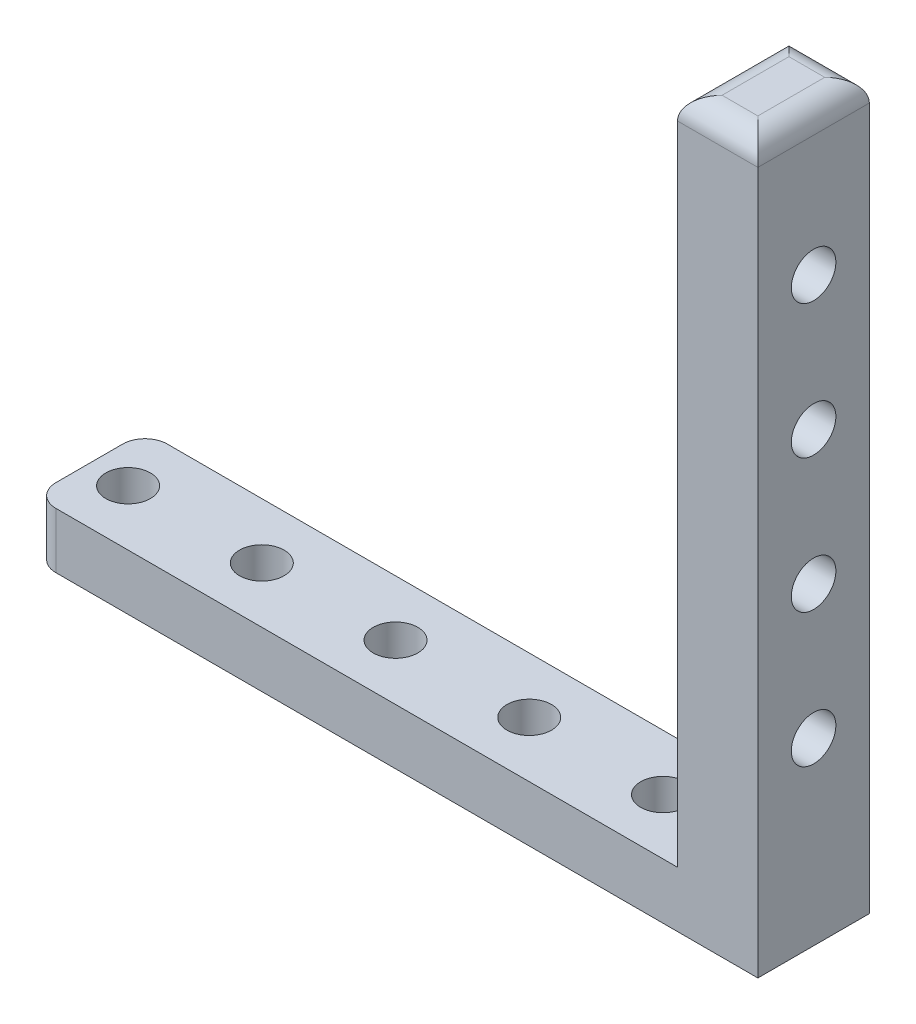
ISO-10303-21;
HEADER;
FILE_DESCRIPTION(('STEP AP214'),'2;1');
FILE_NAME('part.step','',(''),(''),'','','');
FILE_SCHEMA(('AUTOMOTIVE_DESIGN { 1 0 10303 214 1 1 1 1 }'));
ENDSEC;
DATA;
#1=APPLICATION_CONTEXT('core data for automotive mechanical design processes');
#2=APPLICATION_PROTOCOL_DEFINITION('international standard','automotive_design',2000,#1);
#3=PRODUCT_CONTEXT('',#1,'mechanical');
#4=PRODUCT('Part','Part','',(#3));
#5=PRODUCT_RELATED_PRODUCT_CATEGORY('part','',(#4));
#6=PRODUCT_DEFINITION_FORMATION('','',#4);
#7=PRODUCT_DEFINITION_CONTEXT('part definition',#1,'design');
#8=PRODUCT_DEFINITION('design','',#6,#7);
#9=PRODUCT_DEFINITION_SHAPE('','',#8);
#10=(LENGTH_UNIT() NAMED_UNIT(*) SI_UNIT(.MILLI.,.METRE.));
#11=(NAMED_UNIT(*) PLANE_ANGLE_UNIT() SI_UNIT($,.RADIAN.));
#12=(NAMED_UNIT(*) SI_UNIT($,.STERADIAN.) SOLID_ANGLE_UNIT());
#13=UNCERTAINTY_MEASURE_WITH_UNIT(LENGTH_MEASURE(1.E-05),#10,'distance_accuracy_value','');
#14=(GEOMETRIC_REPRESENTATION_CONTEXT(3) GLOBAL_UNCERTAINTY_ASSIGNED_CONTEXT((#13)) GLOBAL_UNIT_ASSIGNED_CONTEXT((#10,
#11,#12)) REPRESENTATION_CONTEXT('',''));
#15=CARTESIAN_POINT('',(0.,0.,0.));
#16=DIRECTION('',(0.,0.,1.));
#17=DIRECTION('',(1.,0.,0.));
#18=AXIS2_PLACEMENT_3D('',#15,#16,#17);
#19=CARTESIAN_POINT('',(-34.3748545633026,-10.,-0.80357142857143));
#20=DIRECTION('',(0.,1.,0.));
#21=DIRECTION('',(0.,0.,1.));
#22=AXIS2_PLACEMENT_3D('',#19,#20,#21);
#23=CYLINDRICAL_SURFACE('',#22,2.);
#24=CARTESIAN_POINT('',(-34.3748545633026,5.,-0.80357142857143));
#25=DIRECTION('',(0.,1.,0.));
#26=DIRECTION('',(0.,0.,1.));
#27=AXIS2_PLACEMENT_3D('',#24,#25,#26);
#28=CIRCLE('',#27,2.);
#29=CARTESIAN_POINT('',(-34.3748545633026,5.,1.19642857142857));
#30=VERTEX_POINT('',#29);
#31=EDGE_CURVE('E238',#30,#30,#28,.T.);
#32=ORIENTED_EDGE('',*,*,#31,.T.);
#33=EDGE_LOOP('',(#32));
#34=FACE_BOUND('',#33,.T.);
#35=CARTESIAN_POINT('',(-34.3748545633026,0.,-0.80357142857143));
#36=DIRECTION('',(0.,1.,0.));
#37=DIRECTION('',(0.,0.,1.));
#38=AXIS2_PLACEMENT_3D('',#35,#36,#37);
#39=CIRCLE('',#38,2.);
#40=CARTESIAN_POINT('',(-34.3748545633026,0.,1.19642857142857));
#41=VERTEX_POINT('',#40);
#42=EDGE_CURVE('E242',#41,#41,#39,.T.);
#43=ORIENTED_EDGE('',*,*,#42,.F.);
#44=EDGE_LOOP('',(#43));
#45=FACE_BOUND('',#44,.T.);
#46=ADVANCED_FACE('F43',(#34,#45),#23,.F.);
#47=CARTESIAN_POINT('',(-22.3748545633026,-10.,-0.80357142857143));
#48=DIRECTION('',(0.,1.,0.));
#49=DIRECTION('',(0.,0.,1.));
#50=AXIS2_PLACEMENT_3D('',#47,#48,#49);
#51=CYLINDRICAL_SURFACE('',#50,2.);
#52=CARTESIAN_POINT('',(-22.3748545633026,5.,-0.80357142857143));
#53=DIRECTION('',(0.,1.,0.));
#54=DIRECTION('',(0.,0.,1.));
#55=AXIS2_PLACEMENT_3D('',#52,#53,#54);
#56=CIRCLE('',#55,2.);
#57=CARTESIAN_POINT('',(-22.3748545633026,5.,1.19642857142857));
#58=VERTEX_POINT('',#57);
#59=EDGE_CURVE('E230',#58,#58,#56,.T.);
#60=ORIENTED_EDGE('',*,*,#59,.T.);
#61=EDGE_LOOP('',(#60));
#62=FACE_BOUND('',#61,.T.);
#63=CARTESIAN_POINT('',(-22.3748545633026,0.,-0.80357142857143));
#64=DIRECTION('',(0.,1.,0.));
#65=DIRECTION('',(0.,0.,1.));
#66=AXIS2_PLACEMENT_3D('',#63,#64,#65);
#67=CIRCLE('',#66,2.);
#68=CARTESIAN_POINT('',(-22.3748545633026,0.,1.19642857142857));
#69=VERTEX_POINT('',#68);
#70=EDGE_CURVE('E234',#69,#69,#67,.T.);
#71=ORIENTED_EDGE('',*,*,#70,.F.);
#72=EDGE_LOOP('',(#71));
#73=FACE_BOUND('',#72,.T.);
#74=ADVANCED_FACE('F330',(#62,#73),#51,.F.);
#75=CARTESIAN_POINT('',(-10.3748545633026,-10.,-0.80357142857143));
#76=DIRECTION('',(0.,1.,0.));
#77=DIRECTION('',(0.,0.,1.));
#78=AXIS2_PLACEMENT_3D('',#75,#76,#77);
#79=CYLINDRICAL_SURFACE('',#78,2.);
#80=CARTESIAN_POINT('',(-10.3748545633026,5.,-0.80357142857143));
#81=DIRECTION('',(0.,1.,0.));
#82=DIRECTION('',(0.,0.,1.));
#83=AXIS2_PLACEMENT_3D('',#80,#81,#82);
#84=CIRCLE('',#83,2.);
#85=CARTESIAN_POINT('',(-10.3748545633026,5.,1.19642857142857));
#86=VERTEX_POINT('',#85);
#87=EDGE_CURVE('E219',#86,#86,#84,.T.);
#88=ORIENTED_EDGE('',*,*,#87,.T.);
#89=EDGE_LOOP('',(#88));
#90=FACE_BOUND('',#89,.T.);
#91=CARTESIAN_POINT('',(-10.3748545633026,0.,-0.80357142857143));
#92=DIRECTION('',(0.,1.,0.));
#93=DIRECTION('',(0.,0.,1.));
#94=AXIS2_PLACEMENT_3D('',#91,#92,#93);
#95=CIRCLE('',#94,2.);
#96=CARTESIAN_POINT('',(-10.3748545633026,0.,1.19642857142857));
#97=VERTEX_POINT('',#96);
#98=EDGE_CURVE('E226',#97,#97,#95,.T.);
#99=ORIENTED_EDGE('',*,*,#98,.F.);
#100=EDGE_LOOP('',(#99));
#101=FACE_BOUND('',#100,.T.);
#102=ADVANCED_FACE('F336',(#90,#101),#79,.F.);
#103=CARTESIAN_POINT('',(-37.8571428571429,5.,-5.80357142857143));
#104=DIRECTION('',(1.,0.,0.));
#105=DIRECTION('',(0.,0.,-1.));
#106=AXIS2_PLACEMENT_3D('',#103,#104,#105);
#107=PLANE('',#106);
#108=DIRECTION('',(0.,0.,1.));
#109=VECTOR('',#108,1.);
#110=CARTESIAN_POINT('',(-37.8571428571429,5.,-5.80357142857143));
#111=LINE('',#110,#109);
#112=CARTESIAN_POINT('',(-37.8571428571429,5.,-3.80357142857143));
#113=VERTEX_POINT('',#112);
#114=CARTESIAN_POINT('',(-37.8571428571429,5.,2.19642857142857));
#115=VERTEX_POINT('',#114);
#116=EDGE_CURVE('E140',#113,#115,#111,.T.);
#117=ORIENTED_EDGE('',*,*,#116,.F.);
#118=DIRECTION('',(0.,-1.,0.));
#119=VECTOR('',#118,1.);
#120=CARTESIAN_POINT('',(-37.8571428571429,5.,-3.80357142857143));
#121=LINE('',#120,#119);
#122=CARTESIAN_POINT('',(-37.8571428571429,0.,-3.80357142857143));
#123=VERTEX_POINT('',#122);
#124=EDGE_CURVE('E205',#113,#123,#121,.T.);
#125=ORIENTED_EDGE('',*,*,#124,.T.);
#126=DIRECTION('',(0.,0.,1.));
#127=VECTOR('',#126,1.);
#128=CARTESIAN_POINT('',(-37.8571428571429,0.,-5.80357142857143));
#129=LINE('',#128,#127);
#130=CARTESIAN_POINT('',(-37.8571428571429,0.,2.19642857142857));
#131=VERTEX_POINT('',#130);
#132=EDGE_CURVE('E173',#123,#131,#129,.T.);
#133=ORIENTED_EDGE('',*,*,#132,.T.);
#134=DIRECTION('',(0.,-1.,0.));
#135=VECTOR('',#134,1.);
#136=CARTESIAN_POINT('',(-37.8571428571429,5.,2.19642857142857));
#137=LINE('',#136,#135);
#138=EDGE_CURVE('E199',#131,#115,#137,.F.);
#139=ORIENTED_EDGE('',*,*,#138,.T.);
#140=EDGE_LOOP('',(#117,#125,#133,#139));
#141=FACE_BOUND('',#140,.T.);
#142=ADVANCED_FACE('F385',(#141),#107,.F.);
#143=CARTESIAN_POINT('',(-37.8571428571429,5.,4.19642857142857));
#144=DIRECTION('',(0.,0.,-1.));
#145=DIRECTION('',(-1.,0.,0.));
#146=AXIS2_PLACEMENT_3D('',#143,#144,#145);
#147=PLANE('',#146);
#148=DIRECTION('',(0.,-1.,0.));
#149=VECTOR('',#148,1.);
#150=CARTESIAN_POINT('',(27.1428571428571,5.,4.19642857142857));
#151=LINE('',#150,#149);
#152=CARTESIAN_POINT('',(27.1428571428571,63.,4.19642857142857));
#153=VERTEX_POINT('',#152);
#154=CARTESIAN_POINT('',(27.1428571428571,0.,4.19642857142857));
#155=VERTEX_POINT('',#154);
#156=EDGE_CURVE('E189',#153,#155,#151,.T.);
#157=ORIENTED_EDGE('',*,*,#156,.F.);
#158=DIRECTION('',(1.,0.,0.));
#159=VECTOR('',#158,1.);
#160=CARTESIAN_POINT('',(-37.8571428571429,63.,4.19642857142857));
#161=LINE('',#160,#159);
#162=CARTESIAN_POINT('',(19.9292264198915,63.,4.19642857142857));
#163=VERTEX_POINT('',#162);
#164=EDGE_CURVE('E11',#153,#163,#161,.F.);
#165=ORIENTED_EDGE('',*,*,#164,.T.);
#166=DIRECTION('',(0.,-1.,0.));
#167=VECTOR('',#166,1.);
#168=CARTESIAN_POINT('',(19.9292264198915,65.,4.19642857142857));
#169=LINE('',#168,#167);
#170=CARTESIAN_POINT('',(19.9292264198915,5.,4.19642857142857));
#171=VERTEX_POINT('',#170);
#172=EDGE_CURVE('E120',#163,#171,#169,.T.);
#173=ORIENTED_EDGE('',*,*,#172,.T.);
#174=DIRECTION('',(1.,0.,0.));
#175=VECTOR('',#174,1.);
#176=CARTESIAN_POINT('',(-37.8571428571429,5.,4.19642857142857));
#177=LINE('',#176,#175);
#178=CARTESIAN_POINT('',(-35.8571428571429,5.,4.19642857142857));
#179=VERTEX_POINT('',#178);
#180=EDGE_CURVE('E124',#179,#171,#177,.T.);
#181=ORIENTED_EDGE('',*,*,#180,.F.);
#182=DIRECTION('',(0.,-1.,0.));
#183=VECTOR('',#182,1.);
#184=CARTESIAN_POINT('',(-35.8571428571429,5.,4.19642857142857));
#185=LINE('',#184,#183);
#186=CARTESIAN_POINT('',(-35.8571428571429,0.,4.19642857142857));
#187=VERTEX_POINT('',#186);
#188=EDGE_CURVE('E192',#179,#187,#185,.T.);
#189=ORIENTED_EDGE('',*,*,#188,.T.);
#190=DIRECTION('',(1.,0.,0.));
#191=VECTOR('',#190,1.);
#192=CARTESIAN_POINT('',(-37.8571428571429,0.,4.19642857142857));
#193=LINE('',#192,#191);
#194=EDGE_CURVE('E176',#187,#155,#193,.T.);
#195=ORIENTED_EDGE('',*,*,#194,.T.);
#196=EDGE_LOOP('',(#157,#165,#173,#181,#189,#195));
#197=FACE_BOUND('',#196,.T.);
#198=ADVANCED_FACE('F122',(#197),#147,.F.);
#199=CARTESIAN_POINT('',(27.1428571428571,5.,-5.80357142857143));
#200=DIRECTION('',(-1.,0.,0.));
#201=DIRECTION('',(0.,0.,1.));
#202=AXIS2_PLACEMENT_3D('',#199,#200,#201);
#203=PLANE('',#202);
#204=CARTESIAN_POINT('',(27.1428571428571,52.14,-0.803571428571429));
#205=DIRECTION('',(-1.,0.,0.));
#206=DIRECTION('',(0.,0.,1.));
#207=AXIS2_PLACEMENT_3D('',#204,#205,#206);
#208=CIRCLE('',#207,2.);
#209=CARTESIAN_POINT('',(27.1428571428571,52.14,1.19642857142857));
#210=VERTEX_POINT('',#209);
#211=EDGE_CURVE('E296',#210,#210,#208,.T.);
#212=ORIENTED_EDGE('',*,*,#211,.T.);
#213=EDGE_LOOP('',(#212));
#214=FACE_BOUND('',#213,.T.);
#215=CARTESIAN_POINT('',(27.1428571428571,16.14,-0.803571428571429));
#216=DIRECTION('',(-1.,0.,0.));
#217=DIRECTION('',(0.,0.,1.));
#218=AXIS2_PLACEMENT_3D('',#215,#216,#217);
#219=CIRCLE('',#218,2.);
#220=CARTESIAN_POINT('',(27.1428571428571,16.14,1.19642857142857));
#221=VERTEX_POINT('',#220);
#222=EDGE_CURVE('E287',#221,#221,#219,.T.);
#223=ORIENTED_EDGE('',*,*,#222,.T.);
#224=EDGE_LOOP('',(#223));
#225=FACE_BOUND('',#224,.T.);
#226=CARTESIAN_POINT('',(27.1428571428571,40.14,-0.803571428571429));
#227=DIRECTION('',(-1.,0.,0.));
#228=DIRECTION('',(0.,0.,1.));
#229=AXIS2_PLACEMENT_3D('',#226,#227,#228);
#230=CIRCLE('',#229,2.);
#231=CARTESIAN_POINT('',(27.1428571428571,40.14,1.19642857142857));
#232=VERTEX_POINT('',#231);
#233=EDGE_CURVE('E303',#232,#232,#230,.T.);
#234=ORIENTED_EDGE('',*,*,#233,.T.);
#235=EDGE_LOOP('',(#234));
#236=FACE_BOUND('',#235,.T.);
#237=CARTESIAN_POINT('',(27.1428571428571,28.14,-0.803571428571429));
#238=DIRECTION('',(-1.,0.,0.));
#239=DIRECTION('',(0.,0.,1.));
#240=AXIS2_PLACEMENT_3D('',#237,#238,#239);
#241=CIRCLE('',#240,2.);
#242=CARTESIAN_POINT('',(27.1428571428571,28.14,1.19642857142857));
#243=VERTEX_POINT('',#242);
#244=EDGE_CURVE('E144',#243,#243,#241,.T.);
#245=ORIENTED_EDGE('',*,*,#244,.T.);
#246=EDGE_LOOP('',(#245));
#247=FACE_BOUND('',#246,.T.);
#248=DIRECTION('',(0.,-1.,0.));
#249=VECTOR('',#248,1.);
#250=CARTESIAN_POINT('',(27.1428571428571,5.,-5.80357142857143));
#251=LINE('',#250,#249);
#252=CARTESIAN_POINT('',(27.1428571428571,63.,-5.80357142857143));
#253=VERTEX_POINT('',#252);
#254=CARTESIAN_POINT('',(27.1428571428571,0.,-5.80357142857143));
#255=VERTEX_POINT('',#254);
#256=EDGE_CURVE('E172',#253,#255,#251,.T.);
#257=ORIENTED_EDGE('',*,*,#256,.F.);
#258=DIRECTION('',(0.,0.,-1.));
#259=VECTOR('',#258,1.);
#260=CARTESIAN_POINT('',(27.1428571428571,63.,-5.80357142857143));
#261=LINE('',#260,#259);
#262=EDGE_CURVE('E259',#253,#153,#261,.F.);
#263=ORIENTED_EDGE('',*,*,#262,.T.);
#264=ORIENTED_EDGE('',*,*,#156,.T.);
#265=DIRECTION('',(0.,0.,-1.));
#266=VECTOR('',#265,1.);
#267=CARTESIAN_POINT('',(27.1428571428571,0.,-5.80357142857143));
#268=LINE('',#267,#266);
#269=EDGE_CURVE('E180',#155,#255,#268,.T.);
#270=ORIENTED_EDGE('',*,*,#269,.T.);
#271=EDGE_LOOP('',(#257,#263,#264,#270));
#272=FACE_BOUND('',#271,.T.);
#273=ADVANCED_FACE('F368',(#214,#225,#236,#247,#272),#203,.F.);
#274=CARTESIAN_POINT('',(-37.8571428571429,5.,-5.80357142857143));
#275=DIRECTION('',(0.,0.,1.));
#276=DIRECTION('',(1.,0.,0.));
#277=AXIS2_PLACEMENT_3D('',#274,#275,#276);
#278=PLANE('',#277);
#279=DIRECTION('',(0.,-1.,0.));
#280=VECTOR('',#279,1.);
#281=CARTESIAN_POINT('',(19.9292264198915,65.,-5.80357142857143));
#282=LINE('',#281,#280);
#283=CARTESIAN_POINT('',(19.9292264198915,63.,-5.80357142857143));
#284=VERTEX_POINT('',#283);
#285=CARTESIAN_POINT('',(19.9292264198915,5.,-5.80357142857143));
#286=VERTEX_POINT('',#285);
#287=EDGE_CURVE('E128',#284,#286,#282,.T.);
#288=ORIENTED_EDGE('',*,*,#287,.F.);
#289=DIRECTION('',(-1.,0.,0.));
#290=VECTOR('',#289,1.);
#291=CARTESIAN_POINT('',(-37.8571428571429,63.,-5.80357142857143));
#292=LINE('',#291,#290);
#293=EDGE_CURVE('E53',#284,#253,#292,.F.);
#294=ORIENTED_EDGE('',*,*,#293,.T.);
#295=ORIENTED_EDGE('',*,*,#256,.T.);
#296=DIRECTION('',(-1.,0.,0.));
#297=VECTOR('',#296,1.);
#298=CARTESIAN_POINT('',(-37.8571428571429,0.,-5.80357142857143));
#299=LINE('',#298,#297);
#300=CARTESIAN_POINT('',(-35.8571428571429,0.,-5.80357142857143));
#301=VERTEX_POINT('',#300);
#302=EDGE_CURVE('E168',#255,#301,#299,.T.);
#303=ORIENTED_EDGE('',*,*,#302,.T.);
#304=DIRECTION('',(0.,-1.,0.));
#305=VECTOR('',#304,1.);
#306=CARTESIAN_POINT('',(-35.8571428571429,5.,-5.80357142857143));
#307=LINE('',#306,#305);
#308=CARTESIAN_POINT('',(-35.8571428571429,5.,-5.80357142857143));
#309=VERTEX_POINT('',#308);
#310=EDGE_CURVE('E212',#301,#309,#307,.F.);
#311=ORIENTED_EDGE('',*,*,#310,.T.);
#312=DIRECTION('',(-1.,0.,0.));
#313=VECTOR('',#312,1.);
#314=CARTESIAN_POINT('',(-37.8571428571429,5.,-5.80357142857143));
#315=LINE('',#314,#313);
#316=EDGE_CURVE('E139',#286,#309,#315,.T.);
#317=ORIENTED_EDGE('',*,*,#316,.F.);
#318=EDGE_LOOP('',(#288,#294,#295,#303,#311,#317));
#319=FACE_BOUND('',#318,.T.);
#320=ADVANCED_FACE('F365',(#319),#278,.F.);
#321=CARTESIAN_POINT('',(0.,5.,0.));
#322=DIRECTION('',(0.,1.,0.));
#323=DIRECTION('',(0.,0.,1.));
#324=AXIS2_PLACEMENT_3D('',#321,#322,#323);
#325=PLANE('',#324);
#326=DIRECTION('',(0.,0.,1.));
#327=VECTOR('',#326,1.);
#328=CARTESIAN_POINT('',(19.9292264198915,5.,-5.80357142857143));
#329=LINE('',#328,#327);
#330=EDGE_CURVE('E129',#286,#171,#329,.T.);
#331=ORIENTED_EDGE('',*,*,#330,.F.);
#332=ORIENTED_EDGE('',*,*,#316,.T.);
#333=CARTESIAN_POINT('',(-35.8571428571429,5.,-3.80357142857143));
#334=DIRECTION('',(0.,1.,0.));
#335=DIRECTION('',(0.,0.,1.));
#336=AXIS2_PLACEMENT_3D('',#333,#334,#335);
#337=CIRCLE('',#336,2.);
#338=EDGE_CURVE('E216',#309,#113,#337,.T.);
#339=ORIENTED_EDGE('',*,*,#338,.T.);
#340=ORIENTED_EDGE('',*,*,#116,.T.);
#341=CARTESIAN_POINT('',(-35.8571428571429,5.,2.19642857142857));
#342=DIRECTION('',(0.,1.,0.));
#343=DIRECTION('',(0.,0.,1.));
#344=AXIS2_PLACEMENT_3D('',#341,#342,#343);
#345=CIRCLE('',#344,2.);
#346=EDGE_CURVE('E137',#115,#179,#345,.T.);
#347=ORIENTED_EDGE('',*,*,#346,.T.);
#348=ORIENTED_EDGE('',*,*,#180,.T.);
#349=EDGE_LOOP('',(#331,#332,#339,#340,#347,#348));
#350=FACE_BOUND('',#349,.T.);
#351=CARTESIAN_POINT('',(1.62514543669738,5.,-0.80357142857143));
#352=DIRECTION('',(0.,1.,0.));
#353=DIRECTION('',(0.,0.,1.));
#354=AXIS2_PLACEMENT_3D('',#351,#352,#353);
#355=CIRCLE('',#354,2.);
#356=CARTESIAN_POINT('',(1.62514543669738,5.,1.19642857142857));
#357=VERTEX_POINT('',#356);
#358=EDGE_CURVE('E154',#357,#357,#355,.T.);
#359=ORIENTED_EDGE('',*,*,#358,.F.);
#360=EDGE_LOOP('',(#359));
#361=FACE_BOUND('',#360,.T.);
#362=CARTESIAN_POINT('',(13.6251454366974,5.,-0.80357142857143));
#363=DIRECTION('',(0.,1.,0.));
#364=DIRECTION('',(0.,0.,1.));
#365=AXIS2_PLACEMENT_3D('',#362,#363,#364);
#366=CIRCLE('',#365,2.);
#367=CARTESIAN_POINT('',(13.6251454366974,5.,1.19642857142857));
#368=VERTEX_POINT('',#367);
#369=EDGE_CURVE('E162',#368,#368,#366,.T.);
#370=ORIENTED_EDGE('',*,*,#369,.F.);
#371=EDGE_LOOP('',(#370));
#372=FACE_BOUND('',#371,.T.);
#373=ORIENTED_EDGE('',*,*,#87,.F.);
#374=EDGE_LOOP('',(#373));
#375=FACE_BOUND('',#374,.T.);
#376=ORIENTED_EDGE('',*,*,#59,.F.);
#377=EDGE_LOOP('',(#376));
#378=FACE_BOUND('',#377,.T.);
#379=ORIENTED_EDGE('',*,*,#31,.F.);
#380=EDGE_LOOP('',(#379));
#381=FACE_BOUND('',#380,.T.);
#382=ADVANCED_FACE('F133',(#350,#361,#372,#375,#378,#381),#325,.T.);
#383=CARTESIAN_POINT('',(0.,0.,0.));
#384=DIRECTION('',(0.,1.,0.));
#385=DIRECTION('',(0.,0.,1.));
#386=AXIS2_PLACEMENT_3D('',#383,#384,#385);
#387=PLANE('',#386);
#388=CARTESIAN_POINT('',(1.62514543669738,0.,-0.80357142857143));
#389=DIRECTION('',(0.,1.,0.));
#390=DIRECTION('',(0.,0.,1.));
#391=AXIS2_PLACEMENT_3D('',#388,#389,#390);
#392=CIRCLE('',#391,2.);
#393=CARTESIAN_POINT('',(1.62514543669738,0.,1.19642857142857));
#394=VERTEX_POINT('',#393);
#395=EDGE_CURVE('E158',#394,#394,#392,.T.);
#396=ORIENTED_EDGE('',*,*,#395,.T.);
#397=EDGE_LOOP('',(#396));
#398=FACE_BOUND('',#397,.T.);
#399=CARTESIAN_POINT('',(13.6251454366974,0.,-0.80357142857143));
#400=DIRECTION('',(0.,1.,0.));
#401=DIRECTION('',(0.,0.,1.));
#402=AXIS2_PLACEMENT_3D('',#399,#400,#401);
#403=CIRCLE('',#402,2.);
#404=CARTESIAN_POINT('',(13.6251454366974,0.,1.19642857142857));
#405=VERTEX_POINT('',#404);
#406=EDGE_CURVE('E166',#405,#405,#403,.T.);
#407=ORIENTED_EDGE('',*,*,#406,.T.);
#408=EDGE_LOOP('',(#407));
#409=FACE_BOUND('',#408,.T.);
#410=ORIENTED_EDGE('',*,*,#132,.F.);
#411=CARTESIAN_POINT('',(-35.8571428571429,0.,-3.80357142857143));
#412=DIRECTION('',(0.,1.,0.));
#413=DIRECTION('',(0.,0.,1.));
#414=AXIS2_PLACEMENT_3D('',#411,#412,#413);
#415=CIRCLE('',#414,2.);
#416=EDGE_CURVE('E209',#123,#301,#415,.F.);
#417=ORIENTED_EDGE('',*,*,#416,.T.);
#418=ORIENTED_EDGE('',*,*,#302,.F.);
#419=ORIENTED_EDGE('',*,*,#269,.F.);
#420=ORIENTED_EDGE('',*,*,#194,.F.);
#421=CARTESIAN_POINT('',(-35.8571428571429,0.,2.19642857142857));
#422=DIRECTION('',(0.,1.,0.));
#423=DIRECTION('',(0.,0.,1.));
#424=AXIS2_PLACEMENT_3D('',#421,#422,#423);
#425=CIRCLE('',#424,2.);
#426=EDGE_CURVE('E195',#187,#131,#425,.F.);
#427=ORIENTED_EDGE('',*,*,#426,.T.);
#428=EDGE_LOOP('',(#410,#417,#418,#419,#420,#427));
#429=FACE_BOUND('',#428,.T.);
#430=ORIENTED_EDGE('',*,*,#98,.T.);
#431=EDGE_LOOP('',(#430));
#432=FACE_BOUND('',#431,.T.);
#433=ORIENTED_EDGE('',*,*,#70,.T.);
#434=EDGE_LOOP('',(#433));
#435=FACE_BOUND('',#434,.T.);
#436=ORIENTED_EDGE('',*,*,#42,.T.);
#437=EDGE_LOOP('',(#436));
#438=FACE_BOUND('',#437,.T.);
#439=ADVANCED_FACE('F376',(#398,#409,#429,#432,#435,#438),#387,.F.);
#440=CARTESIAN_POINT('',(-35.8571428571429,5.,2.19642857142857));
#441=DIRECTION('',(0.,-1.,0.));
#442=DIRECTION('',(0.,0.,-1.));
#443=AXIS2_PLACEMENT_3D('',#440,#441,#442);
#444=CYLINDRICAL_SURFACE('',#443,2.);
#445=ORIENTED_EDGE('',*,*,#346,.F.);
#446=ORIENTED_EDGE('',*,*,#138,.F.);
#447=ORIENTED_EDGE('',*,*,#426,.F.);
#448=ORIENTED_EDGE('',*,*,#188,.F.);
#449=EDGE_LOOP('',(#445,#446,#447,#448));
#450=FACE_BOUND('',#449,.T.);
#451=ADVANCED_FACE('F388',(#450),#444,.T.);
#452=CARTESIAN_POINT('',(-35.8571428571429,5.,-3.80357142857143));
#453=DIRECTION('',(0.,-1.,0.));
#454=DIRECTION('',(0.,0.,-1.));
#455=AXIS2_PLACEMENT_3D('',#452,#453,#454);
#456=CYLINDRICAL_SURFACE('',#455,2.);
#457=ORIENTED_EDGE('',*,*,#338,.F.);
#458=ORIENTED_EDGE('',*,*,#310,.F.);
#459=ORIENTED_EDGE('',*,*,#416,.F.);
#460=ORIENTED_EDGE('',*,*,#124,.F.);
#461=EDGE_LOOP('',(#457,#458,#459,#460));
#462=FACE_BOUND('',#461,.T.);
#463=ADVANCED_FACE('F381',(#462),#456,.T.);
#464=CARTESIAN_POINT('',(13.6251454366974,-10.,-0.80357142857143));
#465=DIRECTION('',(0.,1.,0.));
#466=DIRECTION('',(0.,0.,1.));
#467=AXIS2_PLACEMENT_3D('',#464,#465,#466);
#468=CYLINDRICAL_SURFACE('',#467,2.);
#469=ORIENTED_EDGE('',*,*,#369,.T.);
#470=EDGE_LOOP('',(#469));
#471=FACE_BOUND('',#470,.T.);
#472=ORIENTED_EDGE('',*,*,#406,.F.);
#473=EDGE_LOOP('',(#472));
#474=FACE_BOUND('',#473,.T.);
#475=ADVANCED_FACE('F324',(#471,#474),#468,.F.);
#476=CARTESIAN_POINT('',(1.62514543669738,-10.,-0.80357142857143));
#477=DIRECTION('',(0.,1.,0.));
#478=DIRECTION('',(0.,0.,1.));
#479=AXIS2_PLACEMENT_3D('',#476,#477,#478);
#480=CYLINDRICAL_SURFACE('',#479,2.);
#481=ORIENTED_EDGE('',*,*,#358,.T.);
#482=EDGE_LOOP('',(#481));
#483=FACE_BOUND('',#482,.T.);
#484=ORIENTED_EDGE('',*,*,#395,.F.);
#485=EDGE_LOOP('',(#484));
#486=FACE_BOUND('',#485,.T.);
#487=ADVANCED_FACE('F315',(#483,#486),#480,.F.);
#488=CARTESIAN_POINT('',(19.9292264198915,65.,-5.80357142857143));
#489=DIRECTION('',(1.,0.,0.));
#490=DIRECTION('',(0.,0.,-1.));
#491=AXIS2_PLACEMENT_3D('',#488,#489,#490);
#492=PLANE('',#491);
#493=CARTESIAN_POINT('',(19.9292264198915,52.14,-0.803571428571429));
#494=DIRECTION('',(-1.,0.,0.));
#495=DIRECTION('',(0.,0.,1.));
#496=AXIS2_PLACEMENT_3D('',#493,#494,#495);
#497=CIRCLE('',#496,2.);
#498=CARTESIAN_POINT('',(19.9292264198915,52.14,1.19642857142857));
#499=VERTEX_POINT('',#498);
#500=EDGE_CURVE('E293',#499,#499,#497,.T.);
#501=ORIENTED_EDGE('',*,*,#500,.F.);
#502=EDGE_LOOP('',(#501));
#503=FACE_BOUND('',#502,.T.);
#504=CARTESIAN_POINT('',(19.9292264198915,16.14,-0.803571428571429));
#505=DIRECTION('',(-1.,0.,0.));
#506=DIRECTION('',(0.,0.,1.));
#507=AXIS2_PLACEMENT_3D('',#504,#505,#506);
#508=CIRCLE('',#507,2.);
#509=CARTESIAN_POINT('',(19.9292264198915,16.14,1.19642857142857));
#510=VERTEX_POINT('',#509);
#511=EDGE_CURVE('E281',#510,#510,#508,.T.);
#512=ORIENTED_EDGE('',*,*,#511,.F.);
#513=EDGE_LOOP('',(#512));
#514=FACE_BOUND('',#513,.T.);
#515=CARTESIAN_POINT('',(19.9292264198915,40.14,-0.803571428571429));
#516=DIRECTION('',(-1.,0.,0.));
#517=DIRECTION('',(0.,0.,1.));
#518=AXIS2_PLACEMENT_3D('',#515,#516,#517);
#519=CIRCLE('',#518,2.);
#520=CARTESIAN_POINT('',(19.9292264198915,40.14,1.19642857142857));
#521=VERTEX_POINT('',#520);
#522=EDGE_CURVE('E299',#521,#521,#519,.T.);
#523=ORIENTED_EDGE('',*,*,#522,.F.);
#524=EDGE_LOOP('',(#523));
#525=FACE_BOUND('',#524,.T.);
#526=CARTESIAN_POINT('',(19.9292264198915,28.14,-0.803571428571429));
#527=DIRECTION('',(-1.,0.,0.));
#528=DIRECTION('',(0.,0.,1.));
#529=AXIS2_PLACEMENT_3D('',#526,#527,#528);
#530=CIRCLE('',#529,2.);
#531=CARTESIAN_POINT('',(19.9292264198915,28.14,1.19642857142857));
#532=VERTEX_POINT('',#531);
#533=EDGE_CURVE('E148',#532,#532,#530,.T.);
#534=ORIENTED_EDGE('',*,*,#533,.F.);
#535=EDGE_LOOP('',(#534));
#536=FACE_BOUND('',#535,.T.);
#537=ORIENTED_EDGE('',*,*,#172,.F.);
#538=DIRECTION('',(0.,0.,1.));
#539=VECTOR('',#538,1.);
#540=CARTESIAN_POINT('',(19.9292264198915,63.,-5.80357142857143));
#541=LINE('',#540,#539);
#542=EDGE_CURVE('E61',#163,#284,#541,.F.);
#543=ORIENTED_EDGE('',*,*,#542,.T.);
#544=ORIENTED_EDGE('',*,*,#287,.T.);
#545=ORIENTED_EDGE('',*,*,#330,.T.);
#546=EDGE_LOOP('',(#537,#543,#544,#545));
#547=FACE_BOUND('',#546,.T.);
#548=ADVANCED_FACE('F142',(#503,#514,#525,#536,#547),#492,.F.);
#549=CARTESIAN_POINT('',(0.,65.,0.));
#550=DIRECTION('',(0.,-1.,0.));
#551=DIRECTION('',(0.,0.,-1.));
#552=AXIS2_PLACEMENT_3D('',#549,#550,#551);
#553=PLANE('',#552);
#554=DIRECTION('',(0.,0.,-1.));
#555=VECTOR('',#554,1.);
#556=CARTESIAN_POINT('',(25.1428571428571,65.,0.));
#557=LINE('',#556,#555);
#558=CARTESIAN_POINT('',(25.1428571428571,65.,2.19642857142857));
#559=VERTEX_POINT('',#558);
#560=CARTESIAN_POINT('',(25.1428571428571,65.,-3.80357142857143));
#561=VERTEX_POINT('',#560);
#562=EDGE_CURVE('E252',#559,#561,#557,.T.);
#563=ORIENTED_EDGE('',*,*,#562,.T.);
#564=DIRECTION('',(-1.,0.,0.));
#565=VECTOR('',#564,1.);
#566=CARTESIAN_POINT('',(0.,65.,-3.80357142857143));
#567=LINE('',#566,#565);
#568=CARTESIAN_POINT('',(21.9292264198915,65.,-3.80357142857143));
#569=VERTEX_POINT('',#568);
#570=EDGE_CURVE('E256',#561,#569,#567,.T.);
#571=ORIENTED_EDGE('',*,*,#570,.T.);
#572=DIRECTION('',(0.,0.,1.));
#573=VECTOR('',#572,1.);
#574=CARTESIAN_POINT('',(21.9292264198915,65.,0.));
#575=LINE('',#574,#573);
#576=CARTESIAN_POINT('',(21.9292264198915,65.,2.19642857142857));
#577=VERTEX_POINT('',#576);
#578=EDGE_CURVE('E249',#569,#577,#575,.T.);
#579=ORIENTED_EDGE('',*,*,#578,.T.);
#580=DIRECTION('',(1.,0.,0.));
#581=VECTOR('',#580,1.);
#582=CARTESIAN_POINT('',(0.,65.,2.19642857142857));
#583=LINE('',#582,#581);
#584=EDGE_CURVE('E246',#577,#559,#583,.T.);
#585=ORIENTED_EDGE('',*,*,#584,.T.);
#586=EDGE_LOOP('',(#563,#571,#579,#585));
#587=FACE_BOUND('',#586,.T.);
#588=ADVANCED_FACE('F314',(#587),#553,.F.);
#589=CARTESIAN_POINT('',(79.9292264198915,28.14,-0.803571428571429));
#590=DIRECTION('',(-1.,0.,0.));
#591=DIRECTION('',(0.,0.,1.));
#592=AXIS2_PLACEMENT_3D('',#589,#590,#591);
#593=CYLINDRICAL_SURFACE('',#592,2.);
#594=ORIENTED_EDGE('',*,*,#533,.T.);
#595=EDGE_LOOP('',(#594));
#596=FACE_BOUND('',#595,.T.);
#597=ORIENTED_EDGE('',*,*,#244,.F.);
#598=EDGE_LOOP('',(#597));
#599=FACE_BOUND('',#598,.T.);
#600=ADVANCED_FACE('F310',(#596,#599),#593,.F.);
#601=CARTESIAN_POINT('',(79.9292264198915,40.14,-0.803571428571429));
#602=DIRECTION('',(-1.,0.,0.));
#603=DIRECTION('',(0.,0.,1.));
#604=AXIS2_PLACEMENT_3D('',#601,#602,#603);
#605=CYLINDRICAL_SURFACE('',#604,2.);
#606=ORIENTED_EDGE('',*,*,#522,.T.);
#607=EDGE_LOOP('',(#606));
#608=FACE_BOUND('',#607,.T.);
#609=ORIENTED_EDGE('',*,*,#233,.F.);
#610=EDGE_LOOP('',(#609));
#611=FACE_BOUND('',#610,.T.);
#612=ADVANCED_FACE('F491',(#608,#611),#605,.F.);
#613=CARTESIAN_POINT('',(79.9292264198915,16.14,-0.803571428571429));
#614=DIRECTION('',(-1.,0.,0.));
#615=DIRECTION('',(0.,0.,1.));
#616=AXIS2_PLACEMENT_3D('',#613,#614,#615);
#617=CYLINDRICAL_SURFACE('',#616,2.);
#618=ORIENTED_EDGE('',*,*,#511,.T.);
#619=EDGE_LOOP('',(#618));
#620=FACE_BOUND('',#619,.T.);
#621=ORIENTED_EDGE('',*,*,#222,.F.);
#622=EDGE_LOOP('',(#621));
#623=FACE_BOUND('',#622,.T.);
#624=ADVANCED_FACE('F358',(#620,#623),#617,.F.);
#625=CARTESIAN_POINT('',(79.9292264198915,52.14,-0.803571428571429));
#626=DIRECTION('',(-1.,0.,0.));
#627=DIRECTION('',(0.,0.,1.));
#628=AXIS2_PLACEMENT_3D('',#625,#626,#627);
#629=CYLINDRICAL_SURFACE('',#628,2.);
#630=ORIENTED_EDGE('',*,*,#500,.T.);
#631=EDGE_LOOP('',(#630));
#632=FACE_BOUND('',#631,.T.);
#633=ORIENTED_EDGE('',*,*,#211,.F.);
#634=EDGE_LOOP('',(#633));
#635=FACE_BOUND('',#634,.T.);
#636=ADVANCED_FACE('F353',(#632,#635),#629,.F.);
#637=CARTESIAN_POINT('',(21.9292264198915,63.,0.));
#638=DIRECTION('',(0.,0.,1.));
#639=DIRECTION('',(1.,0.,0.));
#640=AXIS2_PLACEMENT_3D('',#637,#638,#639);
#641=CYLINDRICAL_SURFACE('',#640,2.);
#642=CARTESIAN_POINT('',(21.9292264198915,63.,-3.80357142857143));
#643=DIRECTION('',(-0.707106781186547,0.,0.707106781186547));
#644=DIRECTION('',(-0.707106781186547,0.,-0.707106781186547));
#645=AXIS2_PLACEMENT_3D('',#642,#643,#644);
#646=ELLIPSE('',#645,2.82842712474619,2.);
#647=EDGE_CURVE('E272',#284,#569,#646,.F.);
#648=ORIENTED_EDGE('',*,*,#647,.F.);
#649=ORIENTED_EDGE('',*,*,#542,.F.);
#650=CARTESIAN_POINT('',(21.9292264198915,63.,2.19642857142857));
#651=DIRECTION('',(0.707106781186547,0.,0.707106781186547));
#652=DIRECTION('',(0.707106781186547,0.,-0.707106781186547));
#653=AXIS2_PLACEMENT_3D('',#650,#651,#652);
#654=ELLIPSE('',#653,2.82842712474619,2.);
#655=EDGE_CURVE('E47',#577,#163,#654,.T.);
#656=ORIENTED_EDGE('',*,*,#655,.F.);
#657=ORIENTED_EDGE('',*,*,#578,.F.);
#658=EDGE_LOOP('',(#648,#649,#656,#657));
#659=FACE_BOUND('',#658,.T.);
#660=ADVANCED_FACE('F45',(#659),#641,.T.);
#661=CARTESIAN_POINT('',(0.,63.,2.19642857142857));
#662=DIRECTION('',(1.,0.,0.));
#663=DIRECTION('',(0.,0.,-1.));
#664=AXIS2_PLACEMENT_3D('',#661,#662,#663);
#665=CYLINDRICAL_SURFACE('',#664,2.);
#666=ORIENTED_EDGE('',*,*,#655,.T.);
#667=ORIENTED_EDGE('',*,*,#164,.F.);
#668=CARTESIAN_POINT('',(25.1428571428571,63.,2.19642857142857));
#669=DIRECTION('',(0.707106781186548,0.,-0.707106781186547));
#670=DIRECTION('',(0.707106781186547,0.,0.707106781186548));
#671=AXIS2_PLACEMENT_3D('',#668,#669,#670);
#672=ELLIPSE('',#671,2.82842712474619,2.);
#673=EDGE_CURVE('E270',#559,#153,#672,.T.);
#674=ORIENTED_EDGE('',*,*,#673,.F.);
#675=ORIENTED_EDGE('',*,*,#584,.F.);
#676=EDGE_LOOP('',(#666,#667,#674,#675));
#677=FACE_BOUND('',#676,.T.);
#678=ADVANCED_FACE('F348',(#677),#665,.T.);
#679=CARTESIAN_POINT('',(0.,63.,-3.80357142857143));
#680=DIRECTION('',(-1.,0.,0.));
#681=DIRECTION('',(0.,0.,1.));
#682=AXIS2_PLACEMENT_3D('',#679,#680,#681);
#683=CYLINDRICAL_SURFACE('',#682,2.);
#684=ORIENTED_EDGE('',*,*,#647,.T.);
#685=ORIENTED_EDGE('',*,*,#570,.F.);
#686=CARTESIAN_POINT('',(25.1428571428571,63.,-3.80357142857143));
#687=DIRECTION('',(-0.707106781186547,0.,-0.707106781186548));
#688=DIRECTION('',(-0.707106781186548,0.,0.707106781186547));
#689=AXIS2_PLACEMENT_3D('',#686,#687,#688);
#690=ELLIPSE('',#689,2.82842712474619,2.);
#691=EDGE_CURVE('E267',#253,#561,#690,.F.);
#692=ORIENTED_EDGE('',*,*,#691,.F.);
#693=ORIENTED_EDGE('',*,*,#293,.F.);
#694=EDGE_LOOP('',(#684,#685,#692,#693));
#695=FACE_BOUND('',#694,.T.);
#696=ADVANCED_FACE('F345',(#695),#683,.T.);
#697=CARTESIAN_POINT('',(25.1428571428571,63.,0.));
#698=DIRECTION('',(0.,0.,-1.));
#699=DIRECTION('',(-1.,0.,0.));
#700=AXIS2_PLACEMENT_3D('',#697,#698,#699);
#701=CYLINDRICAL_SURFACE('',#700,2.);
#702=ORIENTED_EDGE('',*,*,#673,.T.);
#703=ORIENTED_EDGE('',*,*,#262,.F.);
#704=ORIENTED_EDGE('',*,*,#691,.T.);
#705=ORIENTED_EDGE('',*,*,#562,.F.);
#706=EDGE_LOOP('',(#702,#703,#704,#705));
#707=FACE_BOUND('',#706,.T.);
#708=ADVANCED_FACE('F342',(#707),#701,.T.);
#709=CLOSED_SHELL('',(#46,#74,#102,#142,#198,#273,#320,#382,#439,#451,#463,#475,#487,#548,#588,
#600,#612,#624,#636,#660,#678,#696,#708));
#710=MANIFOLD_SOLID_BREP('B2',#709);
#711=ADVANCED_BREP_SHAPE_REPRESENTATION('',(#18,#710),#14);
#712=SHAPE_DEFINITION_REPRESENTATION(#9,#711);
ENDSEC;
END-ISO-10303-21;
